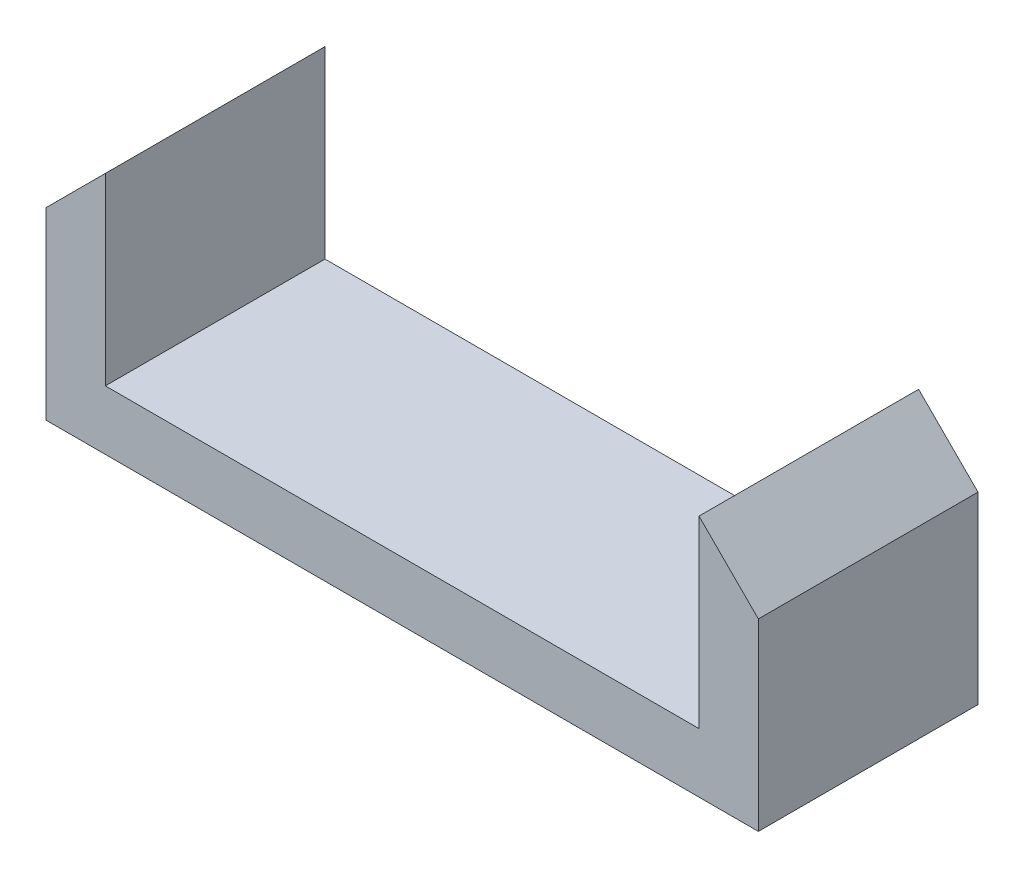
ISO-10303-21;
HEADER;
FILE_DESCRIPTION(('STEP AP214'),'2;1');
FILE_NAME('part.step','',(''),(''),'','','');
FILE_SCHEMA(('AUTOMOTIVE_DESIGN { 1 0 10303 214 1 1 1 1 }'));
ENDSEC;
DATA;
#1=APPLICATION_CONTEXT('core data for automotive mechanical design processes');
#2=APPLICATION_PROTOCOL_DEFINITION('international standard','automotive_design',2000,#1);
#3=PRODUCT_CONTEXT('',#1,'mechanical');
#4=PRODUCT('Part','Part','',(#3));
#5=PRODUCT_RELATED_PRODUCT_CATEGORY('part','',(#4));
#6=PRODUCT_DEFINITION_FORMATION('','',#4);
#7=PRODUCT_DEFINITION_CONTEXT('part definition',#1,'design');
#8=PRODUCT_DEFINITION('design','',#6,#7);
#9=PRODUCT_DEFINITION_SHAPE('','',#8);
#10=(LENGTH_UNIT() NAMED_UNIT(*) SI_UNIT(.MILLI.,.METRE.));
#11=(NAMED_UNIT(*) PLANE_ANGLE_UNIT() SI_UNIT($,.RADIAN.));
#12=(NAMED_UNIT(*) SI_UNIT($,.STERADIAN.) SOLID_ANGLE_UNIT());
#13=UNCERTAINTY_MEASURE_WITH_UNIT(LENGTH_MEASURE(1.E-05),#10,'distance_accuracy_value','');
#14=(GEOMETRIC_REPRESENTATION_CONTEXT(3) GLOBAL_UNCERTAINTY_ASSIGNED_CONTEXT((#13)) GLOBAL_UNIT_ASSIGNED_CONTEXT((#10,
#11,#12)) REPRESENTATION_CONTEXT('',''));
#15=CARTESIAN_POINT('',(0.,0.,0.));
#16=DIRECTION('',(0.,0.,1.));
#17=DIRECTION('',(1.,0.,0.));
#18=AXIS2_PLACEMENT_3D('',#15,#16,#17);
#19=CARTESIAN_POINT('',(-12.,13.2100840336135,3.7));
#20=DIRECTION('',(1.,0.,0.));
#21=DIRECTION('',(0.,0.,-1.));
#22=AXIS2_PLACEMENT_3D('',#19,#20,#21);
#23=PLANE('',#22);
#24=DIRECTION('',(0.,-1.,0.));
#25=VECTOR('',#24,1.);
#26=CARTESIAN_POINT('',(-12.,13.2100840336135,3.7));
#27=LINE('',#26,#25);
#28=CARTESIAN_POINT('',(-12.,12.2100840336135,3.7));
#29=VERTEX_POINT('',#28);
#30=CARTESIAN_POINT('',(-12.,9.11008403361345,3.7));
#31=VERTEX_POINT('',#30);
#32=EDGE_CURVE('E178',#29,#31,#27,.T.);
#33=ORIENTED_EDGE('',*,*,#32,.F.);
#34=DIRECTION('',(0.,0.,1.));
#35=VECTOR('',#34,1.);
#36=CARTESIAN_POINT('',(-12.,12.2100840336135,0.));
#37=LINE('',#36,#35);
#38=CARTESIAN_POINT('',(-12.,12.2100840336135,0.));
#39=VERTEX_POINT('',#38);
#40=EDGE_CURVE('E156',#39,#29,#37,.T.);
#41=ORIENTED_EDGE('',*,*,#40,.F.);
#42=DIRECTION('',(0.,-1.,0.));
#43=VECTOR('',#42,1.);
#44=CARTESIAN_POINT('',(-12.,13.2100840336135,0.));
#45=LINE('',#44,#43);
#46=CARTESIAN_POINT('',(-12.,9.11008403361345,0.));
#47=VERTEX_POINT('',#46);
#48=EDGE_CURVE('E175',#39,#47,#45,.T.);
#49=ORIENTED_EDGE('',*,*,#48,.T.);
#50=DIRECTION('',(0.,0.,-1.));
#51=VECTOR('',#50,1.);
#52=CARTESIAN_POINT('',(-12.,9.11008403361345,3.7));
#53=LINE('',#52,#51);
#54=EDGE_CURVE('E153',#31,#47,#53,.T.);
#55=ORIENTED_EDGE('',*,*,#54,.F.);
#56=EDGE_LOOP('',(#33,#41,#49,#55));
#57=FACE_BOUND('',#56,.T.);
#58=ADVANCED_FACE('F45',(#57),#23,.F.);
#59=CARTESIAN_POINT('',(-12.,9.11008403361345,3.7));
#60=DIRECTION('',(0.,1.,0.));
#61=DIRECTION('',(0.,0.,1.));
#62=AXIS2_PLACEMENT_3D('',#59,#60,#61);
#63=PLANE('',#62);
#64=CARTESIAN_POINT('',(-6.,9.11008403361345,1.7));
#65=DIRECTION('',(0.,-1.,0.));
#66=DIRECTION('',(0.,0.,-1.));
#67=AXIS2_PLACEMENT_3D('',#64,#65,#66);
#68=CIRCLE('',#67,1.3);
#69=CARTESIAN_POINT('',(-6.,9.11008403361345,0.4));
#70=VERTEX_POINT('',#69);
#71=EDGE_CURVE('E54',#70,#70,#68,.T.);
#72=ORIENTED_EDGE('',*,*,#71,.F.);
#73=EDGE_LOOP('',(#72));
#74=FACE_BOUND('',#73,.T.);
#75=DIRECTION('',(1.,0.,0.));
#76=VECTOR('',#75,1.);
#77=CARTESIAN_POINT('',(-12.,9.11008403361345,0.));
#78=LINE('',#77,#76);
#79=CARTESIAN_POINT('',(0.,9.11008403361345,0.));
#80=VERTEX_POINT('',#79);
#81=EDGE_CURVE('E192',#47,#80,#78,.T.);
#82=ORIENTED_EDGE('',*,*,#81,.T.);
#83=DIRECTION('',(0.,0.,-1.));
#84=VECTOR('',#83,1.);
#85=CARTESIAN_POINT('',(0.,9.11008403361345,3.7));
#86=LINE('',#85,#84);
#87=CARTESIAN_POINT('',(0.,9.11008403361345,3.7));
#88=VERTEX_POINT('',#87);
#89=EDGE_CURVE('E189',#88,#80,#86,.T.);
#90=ORIENTED_EDGE('',*,*,#89,.F.);
#91=DIRECTION('',(1.,0.,0.));
#92=VECTOR('',#91,1.);
#93=CARTESIAN_POINT('',(-12.,9.11008403361345,3.7));
#94=LINE('',#93,#92);
#95=EDGE_CURVE('E181',#31,#88,#94,.T.);
#96=ORIENTED_EDGE('',*,*,#95,.F.);
#97=ORIENTED_EDGE('',*,*,#54,.T.);
#98=EDGE_LOOP('',(#82,#90,#96,#97));
#99=FACE_BOUND('',#98,.T.);
#100=ADVANCED_FACE('F205',(#74,#99),#63,.F.);
#101=CARTESIAN_POINT('',(0.,13.2100840336135,3.7));
#102=DIRECTION('',(-1.,0.,0.));
#103=DIRECTION('',(0.,-1.,0.));
#104=AXIS2_PLACEMENT_3D('',#101,#102,#103);
#105=PLANE('',#104);
#106=DIRECTION('',(0.,1.,0.));
#107=VECTOR('',#106,1.);
#108=CARTESIAN_POINT('',(0.,13.2100840336135,0.));
#109=LINE('',#108,#107);
#110=CARTESIAN_POINT('',(0.,12.2100840336135,0.));
#111=VERTEX_POINT('',#110);
#112=EDGE_CURVE('E182',#80,#111,#109,.T.);
#113=ORIENTED_EDGE('',*,*,#112,.T.);
#114=DIRECTION('',(0.,0.,1.));
#115=VECTOR('',#114,1.);
#116=CARTESIAN_POINT('',(0.,12.2100840336135,0.));
#117=LINE('',#116,#115);
#118=CARTESIAN_POINT('',(0.,12.2100840336135,3.7));
#119=VERTEX_POINT('',#118);
#120=EDGE_CURVE('E69',#111,#119,#117,.T.);
#121=ORIENTED_EDGE('',*,*,#120,.T.);
#122=DIRECTION('',(0.,1.,0.));
#123=VECTOR('',#122,1.);
#124=CARTESIAN_POINT('',(0.,13.2100840336135,3.7));
#125=LINE('',#124,#123);
#126=EDGE_CURVE('E185',#88,#119,#125,.T.);
#127=ORIENTED_EDGE('',*,*,#126,.F.);
#128=ORIENTED_EDGE('',*,*,#89,.T.);
#129=EDGE_LOOP('',(#113,#121,#127,#128));
#130=FACE_BOUND('',#129,.T.);
#131=ADVANCED_FACE('F213',(#130),#105,.F.);
#132=CARTESIAN_POINT('',(0.,0.,3.7));
#133=DIRECTION('',(0.,0.,1.));
#134=DIRECTION('',(1.,0.,0.));
#135=AXIS2_PLACEMENT_3D('',#132,#133,#134);
#136=PLANE('',#135);
#137=DIRECTION('',(0.,-1.,0.));
#138=VECTOR('',#137,1.);
#139=CARTESIAN_POINT('',(-11.,13.2100840336135,3.7));
#140=LINE('',#139,#138);
#141=CARTESIAN_POINT('',(-11.,13.2100840336135,3.7));
#142=VERTEX_POINT('',#141);
#143=CARTESIAN_POINT('',(-11.,10.1100840336135,3.7));
#144=VERTEX_POINT('',#143);
#145=EDGE_CURVE('E114',#142,#144,#140,.T.);
#146=ORIENTED_EDGE('',*,*,#145,.F.);
#147=DIRECTION('',(0.707106781186547,0.707106781186547,0.));
#148=VECTOR('',#147,1.);
#149=CARTESIAN_POINT('',(-11.,13.2100840336135,3.7));
#150=LINE('',#149,#148);
#151=EDGE_CURVE('E148',#29,#142,#150,.T.);
#152=ORIENTED_EDGE('',*,*,#151,.F.);
#153=ORIENTED_EDGE('',*,*,#32,.T.);
#154=ORIENTED_EDGE('',*,*,#95,.T.);
#155=ORIENTED_EDGE('',*,*,#126,.T.);
#156=DIRECTION('',(0.707106781186547,-0.707106781186548,0.));
#157=VECTOR('',#156,1.);
#158=CARTESIAN_POINT('',(0.,12.2100840336135,3.7));
#159=LINE('',#158,#157);
#160=CARTESIAN_POINT('',(-1.,13.2100840336135,3.7));
#161=VERTEX_POINT('',#160);
#162=EDGE_CURVE('E163',#161,#119,#159,.T.);
#163=ORIENTED_EDGE('',*,*,#162,.F.);
#164=DIRECTION('',(0.,1.,0.));
#165=VECTOR('',#164,1.);
#166=CARTESIAN_POINT('',(-1.,13.2100840336135,3.7));
#167=LINE('',#166,#165);
#168=CARTESIAN_POINT('',(-1.,10.1100840336135,3.7));
#169=VERTEX_POINT('',#168);
#170=EDGE_CURVE('E135',#169,#161,#167,.T.);
#171=ORIENTED_EDGE('',*,*,#170,.F.);
#172=DIRECTION('',(1.,0.,0.));
#173=VECTOR('',#172,1.);
#174=CARTESIAN_POINT('',(-11.,10.1100840336135,3.7));
#175=LINE('',#174,#173);
#176=EDGE_CURVE('E138',#144,#169,#175,.T.);
#177=ORIENTED_EDGE('',*,*,#176,.F.);
#178=EDGE_LOOP('',(#146,#152,#153,#154,#155,#163,#171,#177));
#179=FACE_BOUND('',#178,.T.);
#180=ADVANCED_FACE('F217',(#179),#136,.T.);
#181=CARTESIAN_POINT('',(0.,0.,0.));
#182=DIRECTION('',(0.,0.,1.));
#183=DIRECTION('',(1.,0.,0.));
#184=AXIS2_PLACEMENT_3D('',#181,#182,#183);
#185=PLANE('',#184);
#186=DIRECTION('',(0.707106781186547,0.707106781186547,0.));
#187=VECTOR('',#186,1.);
#188=CARTESIAN_POINT('',(-11.,13.2100840336135,0.));
#189=LINE('',#188,#187);
#190=CARTESIAN_POINT('',(-11.,13.2100840336135,0.));
#191=VERTEX_POINT('',#190);
#192=EDGE_CURVE('E133',#39,#191,#189,.T.);
#193=ORIENTED_EDGE('',*,*,#192,.T.);
#194=DIRECTION('',(0.,-1.,0.));
#195=VECTOR('',#194,1.);
#196=CARTESIAN_POINT('',(-11.,13.2100840336135,0.));
#197=LINE('',#196,#195);
#198=CARTESIAN_POINT('',(-11.,10.1100840336135,0.));
#199=VERTEX_POINT('',#198);
#200=EDGE_CURVE('E61',#191,#199,#197,.T.);
#201=ORIENTED_EDGE('',*,*,#200,.T.);
#202=DIRECTION('',(1.,0.,0.));
#203=VECTOR('',#202,1.);
#204=CARTESIAN_POINT('',(-11.,10.1100840336135,0.));
#205=LINE('',#204,#203);
#206=CARTESIAN_POINT('',(-1.,10.1100840336135,0.));
#207=VERTEX_POINT('',#206);
#208=EDGE_CURVE('E123',#199,#207,#205,.T.);
#209=ORIENTED_EDGE('',*,*,#208,.T.);
#210=DIRECTION('',(0.,1.,0.));
#211=VECTOR('',#210,1.);
#212=CARTESIAN_POINT('',(-1.,13.2100840336135,0.));
#213=LINE('',#212,#211);
#214=CARTESIAN_POINT('',(-1.,13.2100840336135,0.));
#215=VERTEX_POINT('',#214);
#216=EDGE_CURVE('E120',#207,#215,#213,.T.);
#217=ORIENTED_EDGE('',*,*,#216,.T.);
#218=DIRECTION('',(0.707106781186547,-0.707106781186548,0.));
#219=VECTOR('',#218,1.);
#220=CARTESIAN_POINT('',(0.,12.2100840336135,0.));
#221=LINE('',#220,#219);
#222=EDGE_CURVE('E166',#215,#111,#221,.T.);
#223=ORIENTED_EDGE('',*,*,#222,.T.);
#224=ORIENTED_EDGE('',*,*,#112,.F.);
#225=ORIENTED_EDGE('',*,*,#81,.F.);
#226=ORIENTED_EDGE('',*,*,#48,.F.);
#227=EDGE_LOOP('',(#193,#201,#209,#217,#223,#224,#225,#226));
#228=FACE_BOUND('',#227,.T.);
#229=ADVANCED_FACE('F131',(#228),#185,.F.);
#230=CARTESIAN_POINT('',(0.,12.2100840336135,0.));
#231=DIRECTION('',(-0.707106781186548,-0.707106781186548,0.));
#232=DIRECTION('',(0.707106781186548,-0.707106781186548,0.));
#233=AXIS2_PLACEMENT_3D('',#230,#231,#232);
#234=PLANE('',#233);
#235=ORIENTED_EDGE('',*,*,#162,.T.);
#236=ORIENTED_EDGE('',*,*,#120,.F.);
#237=ORIENTED_EDGE('',*,*,#222,.F.);
#238=DIRECTION('',(0.,0.,1.));
#239=VECTOR('',#238,1.);
#240=CARTESIAN_POINT('',(-1.,13.2100840336135,0.));
#241=LINE('',#240,#239);
#242=EDGE_CURVE('E171',#215,#161,#241,.T.);
#243=ORIENTED_EDGE('',*,*,#242,.T.);
#244=EDGE_LOOP('',(#235,#236,#237,#243));
#245=FACE_BOUND('',#244,.T.);
#246=ADVANCED_FACE('F224',(#245),#234,.F.);
#247=CARTESIAN_POINT('',(-11.,13.2100840336135,0.));
#248=DIRECTION('',(0.707106781186548,-0.707106781186548,0.));
#249=DIRECTION('',(0.707106781186548,0.707106781186548,0.));
#250=AXIS2_PLACEMENT_3D('',#247,#248,#249);
#251=PLANE('',#250);
#252=ORIENTED_EDGE('',*,*,#151,.T.);
#253=DIRECTION('',(0.,0.,1.));
#254=VECTOR('',#253,1.);
#255=CARTESIAN_POINT('',(-11.,13.2100840336135,0.));
#256=LINE('',#255,#254);
#257=EDGE_CURVE('E160',#191,#142,#256,.T.);
#258=ORIENTED_EDGE('',*,*,#257,.F.);
#259=ORIENTED_EDGE('',*,*,#192,.F.);
#260=ORIENTED_EDGE('',*,*,#40,.T.);
#261=EDGE_LOOP('',(#252,#258,#259,#260));
#262=FACE_BOUND('',#261,.T.);
#263=ADVANCED_FACE('F221',(#262),#251,.F.);
#264=CARTESIAN_POINT('',(-6.,8.71008403361345,1.7));
#265=DIRECTION('',(0.,-1.,0.));
#266=DIRECTION('',(0.,0.,-1.));
#267=AXIS2_PLACEMENT_3D('',#264,#265,#266);
#268=PLANE('',#267);
#269=CARTESIAN_POINT('',(-6.,8.71008403361345,1.7));
#270=DIRECTION('',(0.,-1.,0.));
#271=DIRECTION('',(0.,0.,-1.));
#272=AXIS2_PLACEMENT_3D('',#269,#270,#271);
#273=CIRCLE('',#272,0.810102051443364);
#274=CARTESIAN_POINT('',(-6.,8.71008403361345,0.889897948556636));
#275=VERTEX_POINT('',#274);
#276=EDGE_CURVE('E11',#275,#275,#273,.T.);
#277=ORIENTED_EDGE('',*,*,#276,.T.);
#278=EDGE_LOOP('',(#277));
#279=FACE_BOUND('',#278,.T.);
#280=ADVANCED_FACE('F223',(#279),#268,.T.);
#281=CARTESIAN_POINT('',(-6.,9.21008403361345,1.7));
#282=DIRECTION('',(0.,1.,0.));
#283=DIRECTION('',(0.,0.,1.));
#284=AXIS2_PLACEMENT_3D('',#281,#282,#283);
#285=TOROIDAL_SURFACE('',#284,0.810102051443364,0.5);
#286=ORIENTED_EDGE('',*,*,#71,.T.);
#287=EDGE_LOOP('',(#286));
#288=FACE_BOUND('',#287,.T.);
#289=ORIENTED_EDGE('',*,*,#276,.F.);
#290=EDGE_LOOP('',(#289));
#291=FACE_BOUND('',#290,.T.);
#292=ADVANCED_FACE('F47',(#288,#291),#285,.T.);
#293=CARTESIAN_POINT('',(-11.,13.2100840336135,0.));
#294=DIRECTION('',(-1.,0.,0.));
#295=DIRECTION('',(0.,0.,1.));
#296=AXIS2_PLACEMENT_3D('',#293,#294,#295);
#297=PLANE('',#296);
#298=ORIENTED_EDGE('',*,*,#145,.T.);
#299=DIRECTION('',(0.,0.,1.));
#300=VECTOR('',#299,1.);
#301=CARTESIAN_POINT('',(-11.,10.1100840336135,0.));
#302=LINE('',#301,#300);
#303=EDGE_CURVE('E110',#199,#144,#302,.T.);
#304=ORIENTED_EDGE('',*,*,#303,.F.);
#305=ORIENTED_EDGE('',*,*,#200,.F.);
#306=ORIENTED_EDGE('',*,*,#257,.T.);
#307=EDGE_LOOP('',(#298,#304,#305,#306));
#308=FACE_BOUND('',#307,.T.);
#309=ADVANCED_FACE('F112',(#308),#297,.F.);
#310=CARTESIAN_POINT('',(-1.,13.2100840336135,0.));
#311=DIRECTION('',(1.,0.,0.));
#312=DIRECTION('',(0.,0.,-1.));
#313=AXIS2_PLACEMENT_3D('',#310,#311,#312);
#314=PLANE('',#313);
#315=ORIENTED_EDGE('',*,*,#170,.T.);
#316=ORIENTED_EDGE('',*,*,#242,.F.);
#317=ORIENTED_EDGE('',*,*,#216,.F.);
#318=DIRECTION('',(0.,0.,1.));
#319=VECTOR('',#318,1.);
#320=CARTESIAN_POINT('',(-1.,10.1100840336135,0.));
#321=LINE('',#320,#319);
#322=EDGE_CURVE('E119',#207,#169,#321,.T.);
#323=ORIENTED_EDGE('',*,*,#322,.T.);
#324=EDGE_LOOP('',(#315,#316,#317,#323));
#325=FACE_BOUND('',#324,.T.);
#326=ADVANCED_FACE('F286',(#325),#314,.F.);
#327=CARTESIAN_POINT('',(-11.,10.1100840336135,0.));
#328=DIRECTION('',(0.,-1.,0.));
#329=DIRECTION('',(0.,0.,-1.));
#330=AXIS2_PLACEMENT_3D('',#327,#328,#329);
#331=PLANE('',#330);
#332=ORIENTED_EDGE('',*,*,#176,.T.);
#333=ORIENTED_EDGE('',*,*,#322,.F.);
#334=ORIENTED_EDGE('',*,*,#208,.F.);
#335=ORIENTED_EDGE('',*,*,#303,.T.);
#336=EDGE_LOOP('',(#332,#333,#334,#335));
#337=FACE_BOUND('',#336,.T.);
#338=ADVANCED_FACE('F124',(#337),#331,.F.);
#339=CLOSED_SHELL('',(#58,#100,#131,#180,#229,#246,#263,#280,#292,#309,#326,#338));
#340=MANIFOLD_SOLID_BREP('B2',#339);
#341=ADVANCED_BREP_SHAPE_REPRESENTATION('',(#18,#340),#14);
#342=SHAPE_DEFINITION_REPRESENTATION(#9,#341);
ENDSEC;
END-ISO-10303-21;
